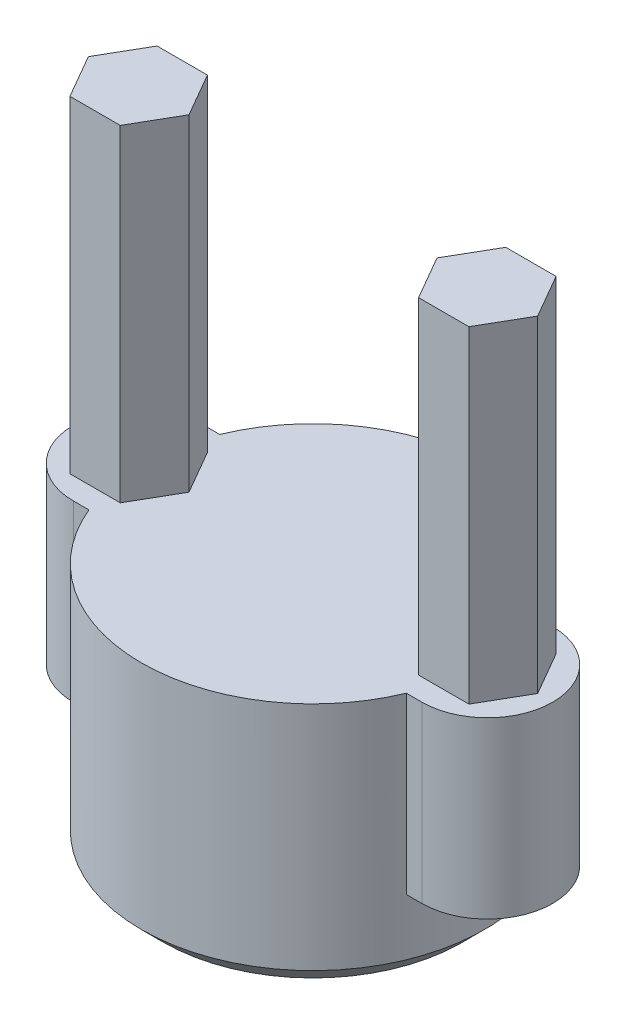
ISO-10303-21;
HEADER;
FILE_DESCRIPTION(('STEP AP214'),'2;1');
FILE_NAME('part.step','',(''),(''),'','','');
FILE_SCHEMA(('AUTOMOTIVE_DESIGN { 1 0 10303 214 1 1 1 1 }'));
ENDSEC;
DATA;
#1=APPLICATION_CONTEXT('core data for automotive mechanical design processes');
#2=APPLICATION_PROTOCOL_DEFINITION('international standard','automotive_design',2000,#1);
#3=PRODUCT_CONTEXT('',#1,'mechanical');
#4=PRODUCT('Part','Part','',(#3));
#5=PRODUCT_RELATED_PRODUCT_CATEGORY('part','',(#4));
#6=PRODUCT_DEFINITION_FORMATION('','',#4);
#7=PRODUCT_DEFINITION_CONTEXT('part definition',#1,'design');
#8=PRODUCT_DEFINITION('design','',#6,#7);
#9=PRODUCT_DEFINITION_SHAPE('','',#8);
#10=(LENGTH_UNIT() NAMED_UNIT(*) SI_UNIT(.MILLI.,.METRE.));
#11=(NAMED_UNIT(*) PLANE_ANGLE_UNIT() SI_UNIT($,.RADIAN.));
#12=(NAMED_UNIT(*) SI_UNIT($,.STERADIAN.) SOLID_ANGLE_UNIT());
#13=UNCERTAINTY_MEASURE_WITH_UNIT(LENGTH_MEASURE(1.E-05),#10,'distance_accuracy_value','');
#14=(GEOMETRIC_REPRESENTATION_CONTEXT(3) GLOBAL_UNCERTAINTY_ASSIGNED_CONTEXT((#13)) GLOBAL_UNIT_ASSIGNED_CONTEXT((#10,
#11,#12)) REPRESENTATION_CONTEXT('',''));
#15=CARTESIAN_POINT('',(0.,0.,0.));
#16=DIRECTION('',(0.,0.,1.));
#17=DIRECTION('',(1.,0.,0.));
#18=AXIS2_PLACEMENT_3D('',#15,#16,#17);
#19=CARTESIAN_POINT('',(0.,0.,0.));
#20=DIRECTION('',(0.,1.,0.));
#21=DIRECTION('',(0.,0.,1.));
#22=AXIS2_PLACEMENT_3D('',#19,#20,#21);
#23=PLANE('',#22);
#24=CARTESIAN_POINT('',(0.,0.,0.));
#25=DIRECTION('',(0.,1.,0.));
#26=DIRECTION('',(0.,0.,1.));
#27=AXIS2_PLACEMENT_3D('',#24,#25,#26);
#28=CIRCLE('',#27,7.875);
#29=CARTESIAN_POINT('',(-7.28118293960535,0.,3.));
#30=VERTEX_POINT('',#29);
#31=CARTESIAN_POINT('',(7.28118293960537,0.,3.));
#32=VERTEX_POINT('',#31);
#33=EDGE_CURVE('E288',#30,#32,#28,.T.);
#34=ORIENTED_EDGE('',*,*,#33,.T.);
#35=DIRECTION('',(1.,0.,0.));
#36=VECTOR('',#35,1.);
#37=CARTESIAN_POINT('',(8.,0.,3.));
#38=LINE('',#37,#36);
#39=CARTESIAN_POINT('',(8.,0.,3.));
#40=VERTEX_POINT('',#39);
#41=EDGE_CURVE('E278',#32,#40,#38,.T.);
#42=ORIENTED_EDGE('',*,*,#41,.T.);
#43=CARTESIAN_POINT('',(8.,0.,0.));
#44=DIRECTION('',(0.,1.,0.));
#45=DIRECTION('',(0.,0.,-1.));
#46=AXIS2_PLACEMENT_3D('',#43,#44,#45);
#47=CIRCLE('',#46,3.);
#48=CARTESIAN_POINT('',(8.,0.,-3.));
#49=VERTEX_POINT('',#48);
#50=EDGE_CURVE('E301',#40,#49,#47,.T.);
#51=ORIENTED_EDGE('',*,*,#50,.T.);
#52=DIRECTION('',(-1.,0.,0.));
#53=VECTOR('',#52,1.);
#54=CARTESIAN_POINT('',(8.,0.,-3.));
#55=LINE('',#54,#53);
#56=CARTESIAN_POINT('',(7.28118293960535,0.,-3.));
#57=VERTEX_POINT('',#56);
#58=EDGE_CURVE('E303',#49,#57,#55,.T.);
#59=ORIENTED_EDGE('',*,*,#58,.T.);
#60=CARTESIAN_POINT('',(-7.28118293960535,0.,-3.));
#61=VERTEX_POINT('',#60);
#62=EDGE_CURVE('E319',#57,#61,#28,.T.);
#63=ORIENTED_EDGE('',*,*,#62,.T.);
#64=DIRECTION('',(-1.,0.,0.));
#65=VECTOR('',#64,1.);
#66=CARTESIAN_POINT('',(-8.,0.,-3.));
#67=LINE('',#66,#65);
#68=CARTESIAN_POINT('',(-8.,0.,-3.));
#69=VERTEX_POINT('',#68);
#70=EDGE_CURVE('E266',#61,#69,#67,.T.);
#71=ORIENTED_EDGE('',*,*,#70,.T.);
#72=CARTESIAN_POINT('',(-8.,0.,0.));
#73=DIRECTION('',(0.,1.,0.));
#74=DIRECTION('',(0.,0.,1.));
#75=AXIS2_PLACEMENT_3D('',#72,#73,#74);
#76=CIRCLE('',#75,3.);
#77=CARTESIAN_POINT('',(-8.,0.,3.));
#78=VERTEX_POINT('',#77);
#79=EDGE_CURVE('E277',#69,#78,#76,.T.);
#80=ORIENTED_EDGE('',*,*,#79,.T.);
#81=DIRECTION('',(1.,0.,0.));
#82=VECTOR('',#81,1.);
#83=CARTESIAN_POINT('',(-8.,0.,3.));
#84=LINE('',#83,#82);
#85=EDGE_CURVE('E276',#78,#30,#84,.T.);
#86=ORIENTED_EDGE('',*,*,#85,.T.);
#87=EDGE_LOOP('',(#34,#42,#51,#59,#63,#71,#80,#86));
#88=FACE_BOUND('',#87,.T.);
#89=DIRECTION('',(0.5,0.,-0.866025403784438));
#90=VECTOR('',#89,1.);
#91=CARTESIAN_POINT('',(10.3094010767585,0.,0.));
#92=LINE('',#91,#90);
#93=CARTESIAN_POINT('',(9.15470053837925,0.,2.));
#94=VERTEX_POINT('',#93);
#95=CARTESIAN_POINT('',(10.3094010767585,0.,0.));
#96=VERTEX_POINT('',#95);
#97=EDGE_CURVE('E248',#94,#96,#92,.T.);
#98=ORIENTED_EDGE('',*,*,#97,.F.);
#99=DIRECTION('',(1.,0.,0.));
#100=VECTOR('',#99,1.);
#101=CARTESIAN_POINT('',(9.15470053837925,0.,2.));
#102=LINE('',#101,#100);
#103=CARTESIAN_POINT('',(6.84529946162075,0.,2.));
#104=VERTEX_POINT('',#103);
#105=EDGE_CURVE('E246',#104,#94,#102,.T.);
#106=ORIENTED_EDGE('',*,*,#105,.F.);
#107=DIRECTION('',(0.5,0.,0.866025403784439));
#108=VECTOR('',#107,1.);
#109=CARTESIAN_POINT('',(6.84529946162075,0.,2.));
#110=LINE('',#109,#108);
#111=CARTESIAN_POINT('',(5.6905989232415,0.,0.));
#112=VERTEX_POINT('',#111);
#113=EDGE_CURVE('E240',#112,#104,#110,.T.);
#114=ORIENTED_EDGE('',*,*,#113,.F.);
#115=DIRECTION('',(-0.5,0.,0.866025403784438));
#116=VECTOR('',#115,1.);
#117=CARTESIAN_POINT('',(5.6905989232415,0.,0.));
#118=LINE('',#117,#116);
#119=CARTESIAN_POINT('',(6.84529946162075,0.,-2.));
#120=VERTEX_POINT('',#119);
#121=EDGE_CURVE('E239',#120,#112,#118,.T.);
#122=ORIENTED_EDGE('',*,*,#121,.F.);
#123=DIRECTION('',(-1.,0.,0.));
#124=VECTOR('',#123,1.);
#125=CARTESIAN_POINT('',(6.84529946162075,0.,-2.));
#126=LINE('',#125,#124);
#127=CARTESIAN_POINT('',(9.15470053837925,0.,-2.));
#128=VERTEX_POINT('',#127);
#129=EDGE_CURVE('E244',#128,#120,#126,.T.);
#130=ORIENTED_EDGE('',*,*,#129,.F.);
#131=DIRECTION('',(-0.5,0.,-0.866025403784438));
#132=VECTOR('',#131,1.);
#133=CARTESIAN_POINT('',(9.15470053837925,0.,-2.));
#134=LINE('',#133,#132);
#135=EDGE_CURVE('E245',#96,#128,#134,.T.);
#136=ORIENTED_EDGE('',*,*,#135,.F.);
#137=EDGE_LOOP('',(#98,#106,#114,#122,#130,#136));
#138=FACE_BOUND('',#137,.T.);
#139=DIRECTION('',(-0.5,0.,-0.866025403784438));
#140=VECTOR('',#139,1.);
#141=CARTESIAN_POINT('',(-5.6905989232415,0.,0.));
#142=LINE('',#141,#140);
#143=CARTESIAN_POINT('',(-5.6905989232415,0.,0.));
#144=VERTEX_POINT('',#143);
#145=CARTESIAN_POINT('',(-6.84529946162075,0.,-2.));
#146=VERTEX_POINT('',#145);
#147=EDGE_CURVE('E463',#144,#146,#142,.T.);
#148=ORIENTED_EDGE('',*,*,#147,.F.);
#149=DIRECTION('',(0.5,0.,-0.866025403784439));
#150=VECTOR('',#149,1.);
#151=CARTESIAN_POINT('',(-6.84529946162075,0.,2.));
#152=LINE('',#151,#150);
#153=CARTESIAN_POINT('',(-6.84529946162075,0.,2.));
#154=VERTEX_POINT('',#153);
#155=EDGE_CURVE('E207',#154,#144,#152,.T.);
#156=ORIENTED_EDGE('',*,*,#155,.F.);
#157=DIRECTION('',(1.,0.,0.));
#158=VECTOR('',#157,1.);
#159=CARTESIAN_POINT('',(-9.15470053837925,0.,2.));
#160=LINE('',#159,#158);
#161=CARTESIAN_POINT('',(-9.15470053837925,0.,2.));
#162=VERTEX_POINT('',#161);
#163=EDGE_CURVE('E202',#162,#154,#160,.T.);
#164=ORIENTED_EDGE('',*,*,#163,.F.);
#165=DIRECTION('',(0.5,0.,0.866025403784438));
#166=VECTOR('',#165,1.);
#167=CARTESIAN_POINT('',(-10.3094010767585,0.,0.));
#168=LINE('',#167,#166);
#169=CARTESIAN_POINT('',(-10.3094010767585,0.,0.));
#170=VERTEX_POINT('',#169);
#171=EDGE_CURVE('E470',#170,#162,#168,.T.);
#172=ORIENTED_EDGE('',*,*,#171,.F.);
#173=DIRECTION('',(-0.5,0.,0.866025403784438));
#174=VECTOR('',#173,1.);
#175=CARTESIAN_POINT('',(-9.15470053837925,0.,-2.));
#176=LINE('',#175,#174);
#177=CARTESIAN_POINT('',(-9.15470053837925,0.,-2.));
#178=VERTEX_POINT('',#177);
#179=EDGE_CURVE('E461',#178,#170,#176,.T.);
#180=ORIENTED_EDGE('',*,*,#179,.F.);
#181=DIRECTION('',(-1.,0.,0.));
#182=VECTOR('',#181,1.);
#183=CARTESIAN_POINT('',(-6.84529946162075,0.,-2.));
#184=LINE('',#183,#182);
#185=EDGE_CURVE('E462',#146,#178,#184,.T.);
#186=ORIENTED_EDGE('',*,*,#185,.F.);
#187=EDGE_LOOP('',(#148,#156,#164,#172,#180,#186));
#188=FACE_BOUND('',#187,.T.);
#189=ADVANCED_FACE('F50',(#88,#138,#188),#23,.T.);
#190=CARTESIAN_POINT('',(0.,-11.6,0.));
#191=DIRECTION('',(0.,1.,0.));
#192=DIRECTION('',(0.,0.,1.));
#193=AXIS2_PLACEMENT_3D('',#190,#191,#192);
#194=CYLINDRICAL_SURFACE('',#193,7.875);
#195=CARTESIAN_POINT('',(0.,-10.6,0.));
#196=DIRECTION('',(0.,1.,0.));
#197=DIRECTION('',(0.,0.,1.));
#198=AXIS2_PLACEMENT_3D('',#195,#196,#197);
#199=CIRCLE('',#198,7.875);
#200=CARTESIAN_POINT('',(0.,-10.6,7.875));
#201=VERTEX_POINT('',#200);
#202=EDGE_CURVE('E57',#201,#201,#199,.T.);
#203=ORIENTED_EDGE('',*,*,#202,.T.);
#204=EDGE_LOOP('',(#203));
#205=FACE_BOUND('',#204,.T.);
#206=DIRECTION('',(0.,1.,0.));
#207=VECTOR('',#206,1.);
#208=CARTESIAN_POINT('',(-7.28118293960535,-8.,-3.));
#209=LINE('',#208,#207);
#210=CARTESIAN_POINT('',(-7.28118293960535,-8.,-3.));
#211=VERTEX_POINT('',#210);
#212=EDGE_CURVE('E290',#211,#61,#209,.T.);
#213=ORIENTED_EDGE('',*,*,#212,.T.);
#214=ORIENTED_EDGE('',*,*,#62,.F.);
#215=DIRECTION('',(0.,1.,0.));
#216=VECTOR('',#215,1.);
#217=CARTESIAN_POINT('',(7.28118293960533,-8.,-3.));
#218=LINE('',#217,#216);
#219=CARTESIAN_POINT('',(7.28118293960533,-8.,-3.));
#220=VERTEX_POINT('',#219);
#221=EDGE_CURVE('E211',#220,#57,#218,.T.);
#222=ORIENTED_EDGE('',*,*,#221,.F.);
#223=CARTESIAN_POINT('',(0.,-8.,0.));
#224=DIRECTION('',(0.,-1.,0.));
#225=DIRECTION('',(0.,0.,-1.));
#226=AXIS2_PLACEMENT_3D('',#223,#224,#225);
#227=CIRCLE('',#226,7.875);
#228=CARTESIAN_POINT('',(7.28118293960537,-8.,3.));
#229=VERTEX_POINT('',#228);
#230=EDGE_CURVE('E304',#220,#229,#227,.T.);
#231=ORIENTED_EDGE('',*,*,#230,.T.);
#232=DIRECTION('',(0.,1.,0.));
#233=VECTOR('',#232,1.);
#234=CARTESIAN_POINT('',(7.28118293960537,-8.,3.));
#235=LINE('',#234,#233);
#236=EDGE_CURVE('E294',#229,#32,#235,.T.);
#237=ORIENTED_EDGE('',*,*,#236,.T.);
#238=ORIENTED_EDGE('',*,*,#33,.F.);
#239=DIRECTION('',(0.,1.,0.));
#240=VECTOR('',#239,1.);
#241=CARTESIAN_POINT('',(-7.28118293960535,-8.,3.));
#242=LINE('',#241,#240);
#243=CARTESIAN_POINT('',(-7.28118293960535,-8.,3.));
#244=VERTEX_POINT('',#243);
#245=EDGE_CURVE('E287',#244,#30,#242,.T.);
#246=ORIENTED_EDGE('',*,*,#245,.F.);
#247=CARTESIAN_POINT('',(0.,-8.,0.));
#248=DIRECTION('',(0.,-1.,0.));
#249=DIRECTION('',(0.,0.,1.));
#250=AXIS2_PLACEMENT_3D('',#247,#248,#249);
#251=CIRCLE('',#250,7.875);
#252=EDGE_CURVE('E267',#244,#211,#251,.T.);
#253=ORIENTED_EDGE('',*,*,#252,.T.);
#254=EDGE_LOOP('',(#213,#214,#222,#231,#237,#238,#246,#253));
#255=FACE_BOUND('',#254,.T.);
#256=ADVANCED_FACE('F332',(#205,#255),#194,.T.);
#257=CARTESIAN_POINT('',(0.,-11.6,0.));
#258=DIRECTION('',(0.,1.,0.));
#259=DIRECTION('',(0.,0.,1.));
#260=AXIS2_PLACEMENT_3D('',#257,#258,#259);
#261=PLANE('',#260);
#262=CARTESIAN_POINT('',(0.,-11.6,0.));
#263=DIRECTION('',(0.,1.,0.));
#264=DIRECTION('',(0.,0.,1.));
#265=AXIS2_PLACEMENT_3D('',#262,#263,#264);
#266=CIRCLE('',#265,6.87499999999998);
#267=CARTESIAN_POINT('',(0.,-11.6,6.87499999999998));
#268=VERTEX_POINT('',#267);
#269=EDGE_CURVE('E11',#268,#268,#266,.F.);
#270=ORIENTED_EDGE('',*,*,#269,.T.);
#271=EDGE_LOOP('',(#270));
#272=FACE_BOUND('',#271,.T.);
#273=CARTESIAN_POINT('',(0.,-11.6000000000001,0.));
#274=DIRECTION('',(0.,-1.,0.));
#275=DIRECTION('',(0.,0.,-1.));
#276=AXIS2_PLACEMENT_3D('',#273,#274,#275);
#277=CIRCLE('',#276,5.15);
#278=CARTESIAN_POINT('',(0.,-11.6000000000001,-5.15));
#279=VERTEX_POINT('',#278);
#280=EDGE_CURVE('E224',#279,#279,#277,.T.);
#281=ORIENTED_EDGE('',*,*,#280,.F.);
#282=EDGE_LOOP('',(#281));
#283=FACE_BOUND('',#282,.T.);
#284=ADVANCED_FACE('F357',(#272,#283),#261,.F.);
#285=CARTESIAN_POINT('',(8.,-8.,-3.));
#286=DIRECTION('',(0.,0.,-1.));
#287=DIRECTION('',(-1.,0.,0.));
#288=AXIS2_PLACEMENT_3D('',#285,#286,#287);
#289=PLANE('',#288);
#290=ORIENTED_EDGE('',*,*,#58,.F.);
#291=DIRECTION('',(0.,1.,0.));
#292=VECTOR('',#291,1.);
#293=CARTESIAN_POINT('',(8.,-8.,-3.));
#294=LINE('',#293,#292);
#295=CARTESIAN_POINT('',(8.,-8.,-3.));
#296=VERTEX_POINT('',#295);
#297=EDGE_CURVE('E212',#296,#49,#294,.T.);
#298=ORIENTED_EDGE('',*,*,#297,.F.);
#299=DIRECTION('',(-1.,0.,0.));
#300=VECTOR('',#299,1.);
#301=CARTESIAN_POINT('',(8.,-8.,-3.));
#302=LINE('',#301,#300);
#303=EDGE_CURVE('E299',#296,#220,#302,.T.);
#304=ORIENTED_EDGE('',*,*,#303,.T.);
#305=ORIENTED_EDGE('',*,*,#221,.T.);
#306=EDGE_LOOP('',(#290,#298,#304,#305));
#307=FACE_BOUND('',#306,.T.);
#308=ADVANCED_FACE('F356',(#307),#289,.T.);
#309=CARTESIAN_POINT('',(8.,-8.,0.));
#310=DIRECTION('',(0.,1.,0.));
#311=DIRECTION('',(0.,0.,1.));
#312=AXIS2_PLACEMENT_3D('',#309,#310,#311);
#313=CYLINDRICAL_SURFACE('',#312,3.);
#314=ORIENTED_EDGE('',*,*,#50,.F.);
#315=DIRECTION('',(0.,1.,0.));
#316=VECTOR('',#315,1.);
#317=CARTESIAN_POINT('',(8.,-8.,3.));
#318=LINE('',#317,#316);
#319=CARTESIAN_POINT('',(8.,-8.,3.));
#320=VERTEX_POINT('',#319);
#321=EDGE_CURVE('E297',#320,#40,#318,.T.);
#322=ORIENTED_EDGE('',*,*,#321,.F.);
#323=CARTESIAN_POINT('',(8.,-8.,0.));
#324=DIRECTION('',(0.,1.,0.));
#325=DIRECTION('',(0.,0.,-1.));
#326=AXIS2_PLACEMENT_3D('',#323,#324,#325);
#327=CIRCLE('',#326,3.);
#328=EDGE_CURVE('E313',#320,#296,#327,.T.);
#329=ORIENTED_EDGE('',*,*,#328,.T.);
#330=ORIENTED_EDGE('',*,*,#297,.T.);
#331=EDGE_LOOP('',(#314,#322,#329,#330));
#332=FACE_BOUND('',#331,.T.);
#333=ADVANCED_FACE('F358',(#332),#313,.T.);
#334=CARTESIAN_POINT('',(8.,-8.,3.));
#335=DIRECTION('',(0.,0.,1.));
#336=DIRECTION('',(1.,0.,0.));
#337=AXIS2_PLACEMENT_3D('',#334,#335,#336);
#338=PLANE('',#337);
#339=ORIENTED_EDGE('',*,*,#41,.F.);
#340=ORIENTED_EDGE('',*,*,#236,.F.);
#341=DIRECTION('',(1.,0.,0.));
#342=VECTOR('',#341,1.);
#343=CARTESIAN_POINT('',(8.,-8.,3.));
#344=LINE('',#343,#342);
#345=EDGE_CURVE('E314',#229,#320,#344,.T.);
#346=ORIENTED_EDGE('',*,*,#345,.T.);
#347=ORIENTED_EDGE('',*,*,#321,.T.);
#348=EDGE_LOOP('',(#339,#340,#346,#347));
#349=FACE_BOUND('',#348,.T.);
#350=ADVANCED_FACE('F349',(#349),#338,.T.);
#351=CARTESIAN_POINT('',(0.,-8.,0.));
#352=DIRECTION('',(0.,-1.,0.));
#353=DIRECTION('',(0.,0.,-1.));
#354=AXIS2_PLACEMENT_3D('',#351,#352,#353);
#355=PLANE('',#354);
#356=ORIENTED_EDGE('',*,*,#230,.F.);
#357=ORIENTED_EDGE('',*,*,#303,.F.);
#358=ORIENTED_EDGE('',*,*,#328,.F.);
#359=ORIENTED_EDGE('',*,*,#345,.F.);
#360=EDGE_LOOP('',(#356,#357,#358,#359));
#361=FACE_BOUND('',#360,.T.);
#362=ADVANCED_FACE('F354',(#361),#355,.T.);
#363=CARTESIAN_POINT('',(-8.,-8.,0.));
#364=DIRECTION('',(0.,1.,0.));
#365=DIRECTION('',(0.,0.,1.));
#366=AXIS2_PLACEMENT_3D('',#363,#364,#365);
#367=CYLINDRICAL_SURFACE('',#366,3.);
#368=ORIENTED_EDGE('',*,*,#79,.F.);
#369=DIRECTION('',(0.,1.,0.));
#370=VECTOR('',#369,1.);
#371=CARTESIAN_POINT('',(-8.,-8.,-3.));
#372=LINE('',#371,#370);
#373=CARTESIAN_POINT('',(-8.,-8.,-3.));
#374=VERTEX_POINT('',#373);
#375=EDGE_CURVE('E285',#374,#69,#372,.T.);
#376=ORIENTED_EDGE('',*,*,#375,.F.);
#377=CARTESIAN_POINT('',(-8.,-8.,0.));
#378=DIRECTION('',(0.,1.,0.));
#379=DIRECTION('',(0.,0.,1.));
#380=AXIS2_PLACEMENT_3D('',#377,#378,#379);
#381=CIRCLE('',#380,3.);
#382=CARTESIAN_POINT('',(-8.,-8.,3.));
#383=VERTEX_POINT('',#382);
#384=EDGE_CURVE('E265',#374,#383,#381,.T.);
#385=ORIENTED_EDGE('',*,*,#384,.T.);
#386=DIRECTION('',(0.,1.,0.));
#387=VECTOR('',#386,1.);
#388=CARTESIAN_POINT('',(-8.,-8.,3.));
#389=LINE('',#388,#387);
#390=EDGE_CURVE('E274',#383,#78,#389,.T.);
#391=ORIENTED_EDGE('',*,*,#390,.T.);
#392=EDGE_LOOP('',(#368,#376,#385,#391));
#393=FACE_BOUND('',#392,.T.);
#394=ADVANCED_FACE('F345',(#393),#367,.T.);
#395=CARTESIAN_POINT('',(-8.,-8.,-3.));
#396=DIRECTION('',(0.,0.,-1.));
#397=DIRECTION('',(-1.,0.,0.));
#398=AXIS2_PLACEMENT_3D('',#395,#396,#397);
#399=PLANE('',#398);
#400=ORIENTED_EDGE('',*,*,#70,.F.);
#401=ORIENTED_EDGE('',*,*,#212,.F.);
#402=DIRECTION('',(-1.,0.,0.));
#403=VECTOR('',#402,1.);
#404=CARTESIAN_POINT('',(-8.,-8.,-3.));
#405=LINE('',#404,#403);
#406=EDGE_CURVE('E275',#211,#374,#405,.T.);
#407=ORIENTED_EDGE('',*,*,#406,.T.);
#408=ORIENTED_EDGE('',*,*,#375,.T.);
#409=EDGE_LOOP('',(#400,#401,#407,#408));
#410=FACE_BOUND('',#409,.T.);
#411=ADVANCED_FACE('F333',(#410),#399,.T.);
#412=CARTESIAN_POINT('',(-8.,-8.,3.));
#413=DIRECTION('',(0.,0.,1.));
#414=DIRECTION('',(1.,0.,0.));
#415=AXIS2_PLACEMENT_3D('',#412,#413,#414);
#416=PLANE('',#415);
#417=ORIENTED_EDGE('',*,*,#85,.F.);
#418=ORIENTED_EDGE('',*,*,#390,.F.);
#419=DIRECTION('',(1.,0.,0.));
#420=VECTOR('',#419,1.);
#421=CARTESIAN_POINT('',(-8.,-8.,3.));
#422=LINE('',#421,#420);
#423=EDGE_CURVE('E264',#383,#244,#422,.T.);
#424=ORIENTED_EDGE('',*,*,#423,.T.);
#425=ORIENTED_EDGE('',*,*,#245,.T.);
#426=EDGE_LOOP('',(#417,#418,#424,#425));
#427=FACE_BOUND('',#426,.T.);
#428=ADVANCED_FACE('F347',(#427),#416,.T.);
#429=CARTESIAN_POINT('',(-8.,-8.,0.));
#430=DIRECTION('',(0.,1.,0.));
#431=DIRECTION('',(0.,0.,1.));
#432=AXIS2_PLACEMENT_3D('',#429,#430,#431);
#433=PLANE('',#432);
#434=ORIENTED_EDGE('',*,*,#384,.F.);
#435=ORIENTED_EDGE('',*,*,#406,.F.);
#436=ORIENTED_EDGE('',*,*,#252,.F.);
#437=ORIENTED_EDGE('',*,*,#423,.F.);
#438=EDGE_LOOP('',(#434,#435,#436,#437));
#439=FACE_BOUND('',#438,.T.);
#440=ADVANCED_FACE('F337',(#439),#433,.F.);
#441=CARTESIAN_POINT('',(9.15470053837925,15.,2.));
#442=DIRECTION('',(0.,0.,-1.));
#443=DIRECTION('',(-1.,0.,0.));
#444=AXIS2_PLACEMENT_3D('',#441,#442,#443);
#445=PLANE('',#444);
#446=ORIENTED_EDGE('',*,*,#105,.T.);
#447=DIRECTION('',(0.,-1.,0.));
#448=VECTOR('',#447,1.);
#449=CARTESIAN_POINT('',(9.15470053837925,15.,2.));
#450=LINE('',#449,#448);
#451=CARTESIAN_POINT('',(9.15470053837925,15.,2.));
#452=VERTEX_POINT('',#451);
#453=EDGE_CURVE('E219',#452,#94,#450,.T.);
#454=ORIENTED_EDGE('',*,*,#453,.F.);
#455=DIRECTION('',(1.,0.,0.));
#456=VECTOR('',#455,1.);
#457=CARTESIAN_POINT('',(9.15470053837925,15.,2.));
#458=LINE('',#457,#456);
#459=CARTESIAN_POINT('',(6.84529946162075,15.,2.));
#460=VERTEX_POINT('',#459);
#461=EDGE_CURVE('E238',#460,#452,#458,.T.);
#462=ORIENTED_EDGE('',*,*,#461,.F.);
#463=DIRECTION('',(0.,-1.,0.));
#464=VECTOR('',#463,1.);
#465=CARTESIAN_POINT('',(6.84529946162075,15.,2.));
#466=LINE('',#465,#464);
#467=EDGE_CURVE('E231',#460,#104,#466,.T.);
#468=ORIENTED_EDGE('',*,*,#467,.T.);
#469=EDGE_LOOP('',(#446,#454,#462,#468));
#470=FACE_BOUND('',#469,.T.);
#471=ADVANCED_FACE('F393',(#470),#445,.F.);
#472=CARTESIAN_POINT('',(10.3094010767585,15.,0.));
#473=DIRECTION('',(-0.866025403784438,0.,-0.5));
#474=DIRECTION('',(-0.5,0.,0.866025403784439));
#475=AXIS2_PLACEMENT_3D('',#472,#473,#474);
#476=PLANE('',#475);
#477=ORIENTED_EDGE('',*,*,#97,.T.);
#478=DIRECTION('',(0.,-1.,0.));
#479=VECTOR('',#478,1.);
#480=CARTESIAN_POINT('',(10.3094010767585,15.,0.));
#481=LINE('',#480,#479);
#482=CARTESIAN_POINT('',(10.3094010767585,15.,0.));
#483=VERTEX_POINT('',#482);
#484=EDGE_CURVE('E225',#483,#96,#481,.T.);
#485=ORIENTED_EDGE('',*,*,#484,.F.);
#486=DIRECTION('',(0.5,0.,-0.866025403784438));
#487=VECTOR('',#486,1.);
#488=CARTESIAN_POINT('',(10.3094010767585,15.,0.));
#489=LINE('',#488,#487);
#490=EDGE_CURVE('E256',#452,#483,#489,.T.);
#491=ORIENTED_EDGE('',*,*,#490,.F.);
#492=ORIENTED_EDGE('',*,*,#453,.T.);
#493=EDGE_LOOP('',(#477,#485,#491,#492));
#494=FACE_BOUND('',#493,.T.);
#495=ADVANCED_FACE('F406',(#494),#476,.F.);
#496=CARTESIAN_POINT('',(9.15470053837925,15.,-2.));
#497=DIRECTION('',(-0.866025403784438,0.,0.5));
#498=DIRECTION('',(0.5,0.,0.866025403784439));
#499=AXIS2_PLACEMENT_3D('',#496,#497,#498);
#500=PLANE('',#499);
#501=ORIENTED_EDGE('',*,*,#135,.T.);
#502=DIRECTION('',(0.,-1.,0.));
#503=VECTOR('',#502,1.);
#504=CARTESIAN_POINT('',(9.15470053837925,15.,-2.));
#505=LINE('',#504,#503);
#506=CARTESIAN_POINT('',(9.15470053837925,15.,-2.));
#507=VERTEX_POINT('',#506);
#508=EDGE_CURVE('E228',#507,#128,#505,.T.);
#509=ORIENTED_EDGE('',*,*,#508,.F.);
#510=DIRECTION('',(-0.5,0.,-0.866025403784438));
#511=VECTOR('',#510,1.);
#512=CARTESIAN_POINT('',(9.15470053837925,15.,-2.));
#513=LINE('',#512,#511);
#514=EDGE_CURVE('E258',#483,#507,#513,.T.);
#515=ORIENTED_EDGE('',*,*,#514,.F.);
#516=ORIENTED_EDGE('',*,*,#484,.T.);
#517=EDGE_LOOP('',(#501,#509,#515,#516));
#518=FACE_BOUND('',#517,.T.);
#519=ADVANCED_FACE('F408',(#518),#500,.F.);
#520=CARTESIAN_POINT('',(6.84529946162075,15.,-2.));
#521=DIRECTION('',(0.,0.,1.));
#522=DIRECTION('',(1.,0.,0.));
#523=AXIS2_PLACEMENT_3D('',#520,#521,#522);
#524=PLANE('',#523);
#525=ORIENTED_EDGE('',*,*,#129,.T.);
#526=DIRECTION('',(0.,-1.,0.));
#527=VECTOR('',#526,1.);
#528=CARTESIAN_POINT('',(6.84529946162075,15.,-2.));
#529=LINE('',#528,#527);
#530=CARTESIAN_POINT('',(6.84529946162075,15.,-2.));
#531=VERTEX_POINT('',#530);
#532=EDGE_CURVE('E230',#531,#120,#529,.T.);
#533=ORIENTED_EDGE('',*,*,#532,.F.);
#534=DIRECTION('',(-1.,0.,0.));
#535=VECTOR('',#534,1.);
#536=CARTESIAN_POINT('',(6.84529946162075,15.,-2.));
#537=LINE('',#536,#535);
#538=EDGE_CURVE('E255',#507,#531,#537,.T.);
#539=ORIENTED_EDGE('',*,*,#538,.F.);
#540=ORIENTED_EDGE('',*,*,#508,.T.);
#541=EDGE_LOOP('',(#525,#533,#539,#540));
#542=FACE_BOUND('',#541,.T.);
#543=ADVANCED_FACE('F405',(#542),#524,.F.);
#544=CARTESIAN_POINT('',(5.6905989232415,15.,0.));
#545=DIRECTION('',(0.866025403784438,0.,0.5));
#546=DIRECTION('',(0.5,0.,-0.866025403784438));
#547=AXIS2_PLACEMENT_3D('',#544,#545,#546);
#548=PLANE('',#547);
#549=ORIENTED_EDGE('',*,*,#121,.T.);
#550=DIRECTION('',(0.,-1.,0.));
#551=VECTOR('',#550,1.);
#552=CARTESIAN_POINT('',(5.6905989232415,15.,0.));
#553=LINE('',#552,#551);
#554=CARTESIAN_POINT('',(5.6905989232415,15.,0.));
#555=VERTEX_POINT('',#554);
#556=EDGE_CURVE('E72',#555,#112,#553,.T.);
#557=ORIENTED_EDGE('',*,*,#556,.F.);
#558=DIRECTION('',(-0.5,0.,0.866025403784438));
#559=VECTOR('',#558,1.);
#560=CARTESIAN_POINT('',(5.6905989232415,15.,0.));
#561=LINE('',#560,#559);
#562=EDGE_CURVE('E252',#531,#555,#561,.T.);
#563=ORIENTED_EDGE('',*,*,#562,.F.);
#564=ORIENTED_EDGE('',*,*,#532,.T.);
#565=EDGE_LOOP('',(#549,#557,#563,#564));
#566=FACE_BOUND('',#565,.T.);
#567=ADVANCED_FACE('F399',(#566),#548,.F.);
#568=CARTESIAN_POINT('',(6.84529946162075,15.,2.));
#569=DIRECTION('',(0.866025403784438,0.,-0.5));
#570=DIRECTION('',(-0.5,0.,-0.866025403784439));
#571=AXIS2_PLACEMENT_3D('',#568,#569,#570);
#572=PLANE('',#571);
#573=ORIENTED_EDGE('',*,*,#113,.T.);
#574=ORIENTED_EDGE('',*,*,#467,.F.);
#575=DIRECTION('',(0.5,0.,0.866025403784439));
#576=VECTOR('',#575,1.);
#577=CARTESIAN_POINT('',(6.84529946162075,15.,2.));
#578=LINE('',#577,#576);
#579=EDGE_CURVE('E237',#555,#460,#578,.T.);
#580=ORIENTED_EDGE('',*,*,#579,.F.);
#581=ORIENTED_EDGE('',*,*,#556,.T.);
#582=EDGE_LOOP('',(#573,#574,#580,#581));
#583=FACE_BOUND('',#582,.T.);
#584=ADVANCED_FACE('F391',(#583),#572,.F.);
#585=CARTESIAN_POINT('',(0.,15.,0.));
#586=DIRECTION('',(0.,-1.,0.));
#587=DIRECTION('',(0.,0.,-1.));
#588=AXIS2_PLACEMENT_3D('',#585,#586,#587);
#589=PLANE('',#588);
#590=ORIENTED_EDGE('',*,*,#461,.T.);
#591=ORIENTED_EDGE('',*,*,#490,.T.);
#592=ORIENTED_EDGE('',*,*,#514,.T.);
#593=ORIENTED_EDGE('',*,*,#538,.T.);
#594=ORIENTED_EDGE('',*,*,#562,.T.);
#595=ORIENTED_EDGE('',*,*,#579,.T.);
#596=EDGE_LOOP('',(#590,#591,#592,#593,#594,#595));
#597=FACE_BOUND('',#596,.T.);
#598=ADVANCED_FACE('F394',(#597),#589,.F.);
#599=CARTESIAN_POINT('',(-6.84529946162075,15.,2.));
#600=DIRECTION('',(-0.866025403784438,0.,-0.5));
#601=DIRECTION('',(-0.5,0.,0.866025403784439));
#602=AXIS2_PLACEMENT_3D('',#599,#600,#601);
#603=PLANE('',#602);
#604=ORIENTED_EDGE('',*,*,#155,.T.);
#605=DIRECTION('',(0.,-1.,0.));
#606=VECTOR('',#605,1.);
#607=CARTESIAN_POINT('',(-5.6905989232415,15.,0.));
#608=LINE('',#607,#606);
#609=CARTESIAN_POINT('',(-5.6905989232415,15.,0.));
#610=VERTEX_POINT('',#609);
#611=EDGE_CURVE('E186',#610,#144,#608,.T.);
#612=ORIENTED_EDGE('',*,*,#611,.F.);
#613=DIRECTION('',(0.5,0.,-0.866025403784439));
#614=VECTOR('',#613,1.);
#615=CARTESIAN_POINT('',(-6.84529946162075,15.,2.));
#616=LINE('',#615,#614);
#617=CARTESIAN_POINT('',(-6.84529946162075,15.,2.));
#618=VERTEX_POINT('',#617);
#619=EDGE_CURVE('E197',#618,#610,#616,.T.);
#620=ORIENTED_EDGE('',*,*,#619,.F.);
#621=DIRECTION('',(0.,-1.,0.));
#622=VECTOR('',#621,1.);
#623=CARTESIAN_POINT('',(-6.84529946162075,15.,2.));
#624=LINE('',#623,#622);
#625=EDGE_CURVE('E459',#618,#154,#624,.T.);
#626=ORIENTED_EDGE('',*,*,#625,.T.);
#627=EDGE_LOOP('',(#604,#612,#620,#626));
#628=FACE_BOUND('',#627,.T.);
#629=ADVANCED_FACE('F210',(#628),#603,.F.);
#630=CARTESIAN_POINT('',(-5.6905989232415,15.,0.));
#631=DIRECTION('',(-0.866025403784438,0.,0.5));
#632=DIRECTION('',(0.5,0.,0.866025403784438));
#633=AXIS2_PLACEMENT_3D('',#630,#631,#632);
#634=PLANE('',#633);
#635=ORIENTED_EDGE('',*,*,#147,.T.);
#636=DIRECTION('',(0.,-1.,0.));
#637=VECTOR('',#636,1.);
#638=CARTESIAN_POINT('',(-6.84529946162075,15.,-2.));
#639=LINE('',#638,#637);
#640=CARTESIAN_POINT('',(-6.84529946162075,15.,-2.));
#641=VERTEX_POINT('',#640);
#642=EDGE_CURVE('E191',#641,#146,#639,.T.);
#643=ORIENTED_EDGE('',*,*,#642,.F.);
#644=DIRECTION('',(-0.5,0.,-0.866025403784438));
#645=VECTOR('',#644,1.);
#646=CARTESIAN_POINT('',(-5.6905989232415,15.,0.));
#647=LINE('',#646,#645);
#648=EDGE_CURVE('E188',#610,#641,#647,.T.);
#649=ORIENTED_EDGE('',*,*,#648,.F.);
#650=ORIENTED_EDGE('',*,*,#611,.T.);
#651=EDGE_LOOP('',(#635,#643,#649,#650));
#652=FACE_BOUND('',#651,.T.);
#653=ADVANCED_FACE('F187',(#652),#634,.F.);
#654=CARTESIAN_POINT('',(-6.84529946162075,15.,-2.));
#655=DIRECTION('',(0.,0.,1.));
#656=DIRECTION('',(1.,0.,0.));
#657=AXIS2_PLACEMENT_3D('',#654,#655,#656);
#658=PLANE('',#657);
#659=ORIENTED_EDGE('',*,*,#185,.T.);
#660=DIRECTION('',(0.,-1.,0.));
#661=VECTOR('',#660,1.);
#662=CARTESIAN_POINT('',(-9.15470053837925,15.,-2.));
#663=LINE('',#662,#661);
#664=CARTESIAN_POINT('',(-9.15470053837925,15.,-2.));
#665=VERTEX_POINT('',#664);
#666=EDGE_CURVE('E216',#665,#178,#663,.T.);
#667=ORIENTED_EDGE('',*,*,#666,.F.);
#668=DIRECTION('',(-1.,0.,0.));
#669=VECTOR('',#668,1.);
#670=CARTESIAN_POINT('',(-6.84529946162075,15.,-2.));
#671=LINE('',#670,#669);
#672=EDGE_CURVE('E198',#641,#665,#671,.T.);
#673=ORIENTED_EDGE('',*,*,#672,.F.);
#674=ORIENTED_EDGE('',*,*,#642,.T.);
#675=EDGE_LOOP('',(#659,#667,#673,#674));
#676=FACE_BOUND('',#675,.T.);
#677=ADVANCED_FACE('F425',(#676),#658,.F.);
#678=CARTESIAN_POINT('',(-9.15470053837925,15.,-2.));
#679=DIRECTION('',(0.866025403784438,0.,0.5));
#680=DIRECTION('',(0.5,0.,-0.866025403784439));
#681=AXIS2_PLACEMENT_3D('',#678,#679,#680);
#682=PLANE('',#681);
#683=ORIENTED_EDGE('',*,*,#179,.T.);
#684=DIRECTION('',(0.,-1.,0.));
#685=VECTOR('',#684,1.);
#686=CARTESIAN_POINT('',(-10.3094010767585,15.,0.));
#687=LINE('',#686,#685);
#688=CARTESIAN_POINT('',(-10.3094010767585,15.,0.));
#689=VERTEX_POINT('',#688);
#690=EDGE_CURVE('E472',#689,#170,#687,.T.);
#691=ORIENTED_EDGE('',*,*,#690,.F.);
#692=DIRECTION('',(-0.5,0.,0.866025403784438));
#693=VECTOR('',#692,1.);
#694=CARTESIAN_POINT('',(-9.15470053837925,15.,-2.));
#695=LINE('',#694,#693);
#696=EDGE_CURVE('E454',#665,#689,#695,.T.);
#697=ORIENTED_EDGE('',*,*,#696,.F.);
#698=ORIENTED_EDGE('',*,*,#666,.T.);
#699=EDGE_LOOP('',(#683,#691,#697,#698));
#700=FACE_BOUND('',#699,.T.);
#701=ADVANCED_FACE('F422',(#700),#682,.F.);
#702=CARTESIAN_POINT('',(-10.3094010767585,15.,0.));
#703=DIRECTION('',(0.866025403784438,0.,-0.5));
#704=DIRECTION('',(-0.5,0.,-0.866025403784439));
#705=AXIS2_PLACEMENT_3D('',#702,#703,#704);
#706=PLANE('',#705);
#707=ORIENTED_EDGE('',*,*,#171,.T.);
#708=DIRECTION('',(0.,-1.,0.));
#709=VECTOR('',#708,1.);
#710=CARTESIAN_POINT('',(-9.15470053837925,15.,2.));
#711=LINE('',#710,#709);
#712=CARTESIAN_POINT('',(-9.15470053837925,15.,2.));
#713=VERTEX_POINT('',#712);
#714=EDGE_CURVE('E62',#713,#162,#711,.T.);
#715=ORIENTED_EDGE('',*,*,#714,.F.);
#716=DIRECTION('',(0.5,0.,0.866025403784438));
#717=VECTOR('',#716,1.);
#718=CARTESIAN_POINT('',(-10.3094010767585,15.,0.));
#719=LINE('',#718,#717);
#720=EDGE_CURVE('E457',#689,#713,#719,.T.);
#721=ORIENTED_EDGE('',*,*,#720,.F.);
#722=ORIENTED_EDGE('',*,*,#690,.T.);
#723=EDGE_LOOP('',(#707,#715,#721,#722));
#724=FACE_BOUND('',#723,.T.);
#725=ADVANCED_FACE('F427',(#724),#706,.F.);
#726=CARTESIAN_POINT('',(-9.15470053837925,15.,2.));
#727=DIRECTION('',(0.,0.,-1.));
#728=DIRECTION('',(-1.,0.,0.));
#729=AXIS2_PLACEMENT_3D('',#726,#727,#728);
#730=PLANE('',#729);
#731=ORIENTED_EDGE('',*,*,#163,.T.);
#732=ORIENTED_EDGE('',*,*,#625,.F.);
#733=DIRECTION('',(1.,0.,0.));
#734=VECTOR('',#733,1.);
#735=CARTESIAN_POINT('',(-9.15470053837925,15.,2.));
#736=LINE('',#735,#734);
#737=EDGE_CURVE('E203',#713,#618,#736,.T.);
#738=ORIENTED_EDGE('',*,*,#737,.F.);
#739=ORIENTED_EDGE('',*,*,#714,.T.);
#740=EDGE_LOOP('',(#731,#732,#738,#739));
#741=FACE_BOUND('',#740,.T.);
#742=ADVANCED_FACE('F433',(#741),#730,.F.);
#743=CARTESIAN_POINT('',(0.,15.,0.));
#744=DIRECTION('',(0.,1.,0.));
#745=DIRECTION('',(0.,0.,1.));
#746=AXIS2_PLACEMENT_3D('',#743,#744,#745);
#747=PLANE('',#746);
#748=ORIENTED_EDGE('',*,*,#619,.T.);
#749=ORIENTED_EDGE('',*,*,#648,.T.);
#750=ORIENTED_EDGE('',*,*,#672,.T.);
#751=ORIENTED_EDGE('',*,*,#696,.T.);
#752=ORIENTED_EDGE('',*,*,#720,.T.);
#753=ORIENTED_EDGE('',*,*,#737,.T.);
#754=EDGE_LOOP('',(#748,#749,#750,#751,#752,#753));
#755=FACE_BOUND('',#754,.T.);
#756=ADVANCED_FACE('F199',(#755),#747,.T.);
#757=CARTESIAN_POINT('',(0.,-9.39963235294116,0.));
#758=DIRECTION('',(0.,-1.,0.));
#759=DIRECTION('',(-1.,0.,0.));
#760=AXIS2_PLACEMENT_3D('',#757,#758,#759);
#761=SPHERICAL_SURFACE('',#760,5.60036764705884);
#762=ORIENTED_EDGE('',*,*,#280,.T.);
#763=EDGE_LOOP('',(#762));
#764=FACE_BOUND('',#763,.T.);
#765=ADVANCED_FACE('F438',(#764),#761,.T.);
#766=CARTESIAN_POINT('',(0.,-10.6,0.));
#767=DIRECTION('',(0.,1.,0.));
#768=DIRECTION('',(0.,0.,1.));
#769=AXIS2_PLACEMENT_3D('',#766,#767,#768);
#770=CONICAL_SURFACE('',#769,7.875,0.78539816339745);
#771=ORIENTED_EDGE('',*,*,#269,.F.);
#772=EDGE_LOOP('',(#771));
#773=FACE_BOUND('',#772,.T.);
#774=ORIENTED_EDGE('',*,*,#202,.F.);
#775=EDGE_LOOP('',(#774));
#776=FACE_BOUND('',#775,.T.);
#777=ADVANCED_FACE('F49',(#773,#776),#770,.T.);
#778=CLOSED_SHELL('',(#189,#256,#284,#308,#333,#350,#362,#394,#411,#428,#440,#471,#495,#519,
#543,#567,#584,#598,#629,#653,#677,#701,#725,#742,#756,#765,#777));
#779=MANIFOLD_SOLID_BREP('B2',#778);
#780=ADVANCED_BREP_SHAPE_REPRESENTATION('',(#18,#779),#14);
#781=SHAPE_DEFINITION_REPRESENTATION(#9,#780);
ENDSEC;
END-ISO-10303-21;
